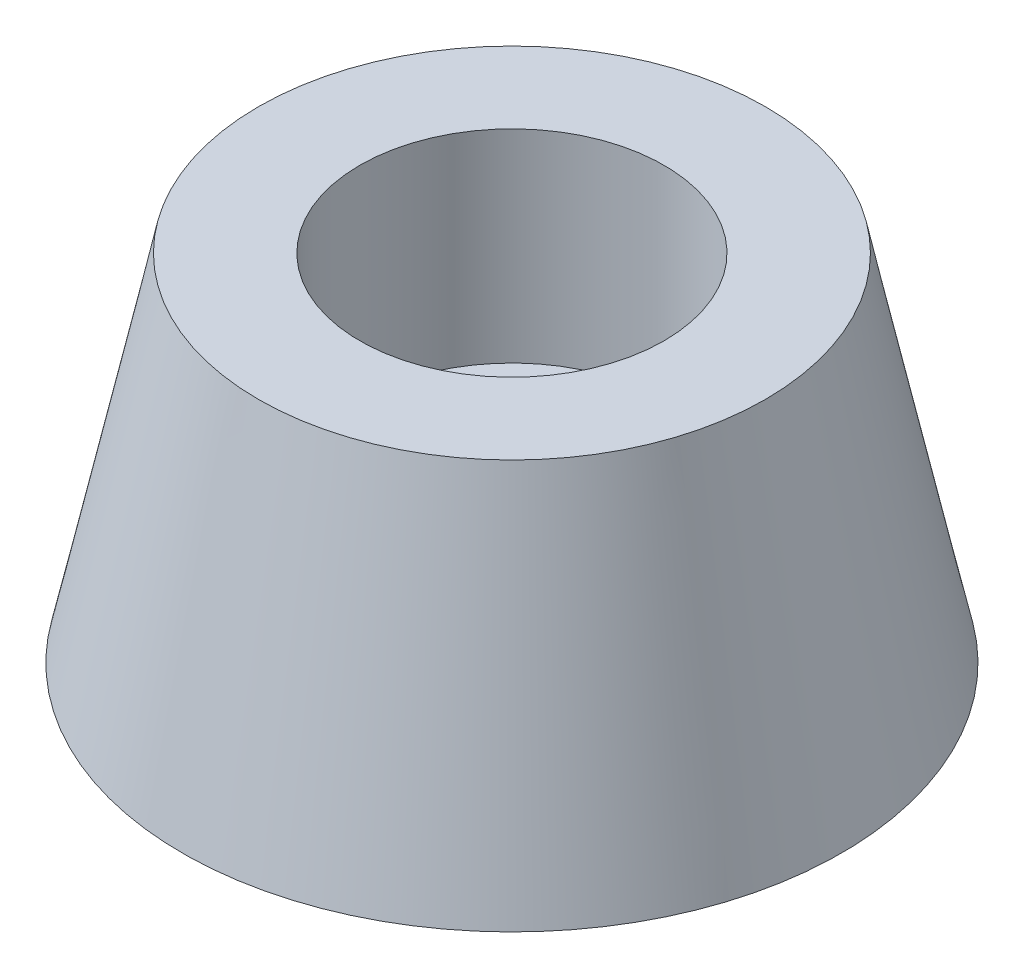
ISO-10303-21;
HEADER;
FILE_DESCRIPTION(('STEP AP214'),'2;1');
FILE_NAME('part.step','',(''),(''),'','','');
FILE_SCHEMA(('AUTOMOTIVE_DESIGN { 1 0 10303 214 1 1 1 1 }'));
ENDSEC;
DATA;
#1=APPLICATION_CONTEXT('core data for automotive mechanical design processes');
#2=APPLICATION_PROTOCOL_DEFINITION('international standard','automotive_design',2000,#1);
#3=PRODUCT_CONTEXT('',#1,'mechanical');
#4=PRODUCT('Part','Part','',(#3));
#5=PRODUCT_RELATED_PRODUCT_CATEGORY('part','',(#4));
#6=PRODUCT_DEFINITION_FORMATION('','',#4);
#7=PRODUCT_DEFINITION_CONTEXT('part definition',#1,'design');
#8=PRODUCT_DEFINITION('design','',#6,#7);
#9=PRODUCT_DEFINITION_SHAPE('','',#8);
#10=(LENGTH_UNIT() NAMED_UNIT(*) SI_UNIT(.MILLI.,.METRE.));
#11=(NAMED_UNIT(*) PLANE_ANGLE_UNIT() SI_UNIT($,.RADIAN.));
#12=(NAMED_UNIT(*) SI_UNIT($,.STERADIAN.) SOLID_ANGLE_UNIT());
#13=UNCERTAINTY_MEASURE_WITH_UNIT(LENGTH_MEASURE(1.E-05),#10,'distance_accuracy_value','');
#14=(GEOMETRIC_REPRESENTATION_CONTEXT(3) GLOBAL_UNCERTAINTY_ASSIGNED_CONTEXT((#13)) GLOBAL_UNIT_ASSIGNED_CONTEXT((#10,
#11,#12)) REPRESENTATION_CONTEXT('',''));
#15=CARTESIAN_POINT('',(0.,0.,0.));
#16=DIRECTION('',(0.,0.,1.));
#17=DIRECTION('',(1.,0.,0.));
#18=AXIS2_PLACEMENT_3D('',#15,#16,#17);
#19=CARTESIAN_POINT('',(0.,-10.,0.));
#20=DIRECTION('',(0.,1.,0.));
#21=DIRECTION('',(-1.,0.,0.));
#22=AXIS2_PLACEMENT_3D('',#19,#20,#21);
#23=CYLINDRICAL_SURFACE('',#22,1.65);
#24=CARTESIAN_POINT('',(0.,-7.,0.));
#25=DIRECTION('',(0.,1.,0.));
#26=DIRECTION('',(-1.,0.,0.));
#27=AXIS2_PLACEMENT_3D('',#24,#25,#26);
#28=CIRCLE('',#27,1.65);
#29=CARTESIAN_POINT('',(-1.65,-7.,0.));
#30=VERTEX_POINT('',#29);
#31=EDGE_CURVE('E59',#30,#30,#28,.T.);
#32=ORIENTED_EDGE('',*,*,#31,.F.);
#33=EDGE_LOOP('',(#32));
#34=FACE_BOUND('',#33,.T.);
#35=CARTESIAN_POINT('',(0.,-4.,0.));
#36=DIRECTION('',(0.,1.,0.));
#37=DIRECTION('',(-1.,0.,0.));
#38=AXIS2_PLACEMENT_3D('',#35,#36,#37);
#39=CIRCLE('',#38,1.65);
#40=CARTESIAN_POINT('',(-1.65,-4.,0.));
#41=VERTEX_POINT('',#40);
#42=EDGE_CURVE('E49',#41,#41,#39,.F.);
#43=ORIENTED_EDGE('',*,*,#42,.F.);
#44=EDGE_LOOP('',(#43));
#45=FACE_BOUND('',#44,.T.);
#46=ADVANCED_FACE('F45',(#34,#45),#23,.F.);
#47=CARTESIAN_POINT('',(0.,-7.,0.));
#48=DIRECTION('',(0.,1.,0.));
#49=DIRECTION('',(-1.,0.,0.));
#50=AXIS2_PLACEMENT_3D('',#47,#48,#49);
#51=PLANE('',#50);
#52=ORIENTED_EDGE('',*,*,#31,.T.);
#53=EDGE_LOOP('',(#52));
#54=FACE_BOUND('',#53,.T.);
#55=CARTESIAN_POINT('',(0.,-7.,0.));
#56=DIRECTION('',(0.,1.,0.));
#57=DIRECTION('',(-1.,0.,0.));
#58=AXIS2_PLACEMENT_3D('',#55,#56,#57);
#59=CIRCLE('',#58,6.5);
#60=CARTESIAN_POINT('',(-6.5,-7.,0.));
#61=VERTEX_POINT('',#60);
#62=EDGE_CURVE('E10',#61,#61,#59,.T.);
#63=ORIENTED_EDGE('',*,*,#62,.F.);
#64=EDGE_LOOP('',(#63));
#65=FACE_BOUND('',#64,.T.);
#66=ADVANCED_FACE('F47',(#54,#65),#51,.F.);
#67=CARTESIAN_POINT('',(0.,-7.,0.));
#68=DIRECTION('',(0.,-1.,0.));
#69=DIRECTION('',(1.,0.,0.));
#70=AXIS2_PLACEMENT_3D('',#67,#68,#69);
#71=CONICAL_SURFACE('',#70,6.5,0.211093333222747);
#72=CARTESIAN_POINT('',(0.,0.,0.));
#73=DIRECTION('',(0.,1.,0.));
#74=DIRECTION('',(-1.,0.,0.));
#75=AXIS2_PLACEMENT_3D('',#72,#73,#74);
#76=CIRCLE('',#75,5.);
#77=CARTESIAN_POINT('',(-5.,0.,0.));
#78=VERTEX_POINT('',#77);
#79=EDGE_CURVE('E54',#78,#78,#76,.T.);
#80=ORIENTED_EDGE('',*,*,#79,.F.);
#81=EDGE_LOOP('',(#80));
#82=FACE_BOUND('',#81,.T.);
#83=ORIENTED_EDGE('',*,*,#62,.T.);
#84=EDGE_LOOP('',(#83));
#85=FACE_BOUND('',#84,.T.);
#86=ADVANCED_FACE('F87',(#82,#85),#71,.T.);
#87=CARTESIAN_POINT('',(0.,0.,0.));
#88=DIRECTION('',(0.,1.,0.));
#89=DIRECTION('',(-1.,0.,0.));
#90=AXIS2_PLACEMENT_3D('',#87,#88,#89);
#91=PLANE('',#90);
#92=CARTESIAN_POINT('',(0.,0.,0.));
#93=DIRECTION('',(0.,1.,0.));
#94=DIRECTION('',(-1.,0.,0.));
#95=AXIS2_PLACEMENT_3D('',#92,#93,#94);
#96=CIRCLE('',#95,3.);
#97=CARTESIAN_POINT('',(-3.,0.,0.));
#98=VERTEX_POINT('',#97);
#99=EDGE_CURVE('E65',#98,#98,#96,.T.);
#100=ORIENTED_EDGE('',*,*,#99,.F.);
#101=EDGE_LOOP('',(#100));
#102=FACE_BOUND('',#101,.T.);
#103=ORIENTED_EDGE('',*,*,#79,.T.);
#104=EDGE_LOOP('',(#103));
#105=FACE_BOUND('',#104,.T.);
#106=ADVANCED_FACE('F94',(#102,#105),#91,.T.);
#107=CARTESIAN_POINT('',(0.,-4.,0.));
#108=DIRECTION('',(0.,1.,0.));
#109=DIRECTION('',(-1.,0.,0.));
#110=AXIS2_PLACEMENT_3D('',#107,#108,#109);
#111=PLANE('',#110);
#112=CARTESIAN_POINT('',(0.,-4.,0.));
#113=DIRECTION('',(0.,1.,0.));
#114=DIRECTION('',(-1.,0.,0.));
#115=AXIS2_PLACEMENT_3D('',#112,#113,#114);
#116=CIRCLE('',#115,3.);
#117=CARTESIAN_POINT('',(-3.,-4.,0.));
#118=VERTEX_POINT('',#117);
#119=EDGE_CURVE('E69',#118,#118,#116,.T.);
#120=ORIENTED_EDGE('',*,*,#119,.T.);
#121=EDGE_LOOP('',(#120));
#122=FACE_BOUND('',#121,.T.);
#123=ORIENTED_EDGE('',*,*,#42,.T.);
#124=EDGE_LOOP('',(#123));
#125=FACE_BOUND('',#124,.T.);
#126=ADVANCED_FACE('F78',(#122,#125),#111,.T.);
#127=CARTESIAN_POINT('',(0.,-4.,0.));
#128=DIRECTION('',(0.,1.,0.));
#129=DIRECTION('',(-1.,0.,0.));
#130=AXIS2_PLACEMENT_3D('',#127,#128,#129);
#131=CYLINDRICAL_SURFACE('',#130,3.);
#132=ORIENTED_EDGE('',*,*,#119,.F.);
#133=EDGE_LOOP('',(#132));
#134=FACE_BOUND('',#133,.T.);
#135=ORIENTED_EDGE('',*,*,#99,.T.);
#136=EDGE_LOOP('',(#135));
#137=FACE_BOUND('',#136,.T.);
#138=ADVANCED_FACE('F92',(#134,#137),#131,.F.);
#139=CLOSED_SHELL('',(#46,#66,#86,#106,#126,#138));
#140=MANIFOLD_SOLID_BREP('B2',#139);
#141=ADVANCED_BREP_SHAPE_REPRESENTATION('',(#18,#140),#14);
#142=SHAPE_DEFINITION_REPRESENTATION(#9,#141);
ENDSEC;
END-ISO-10303-21;
